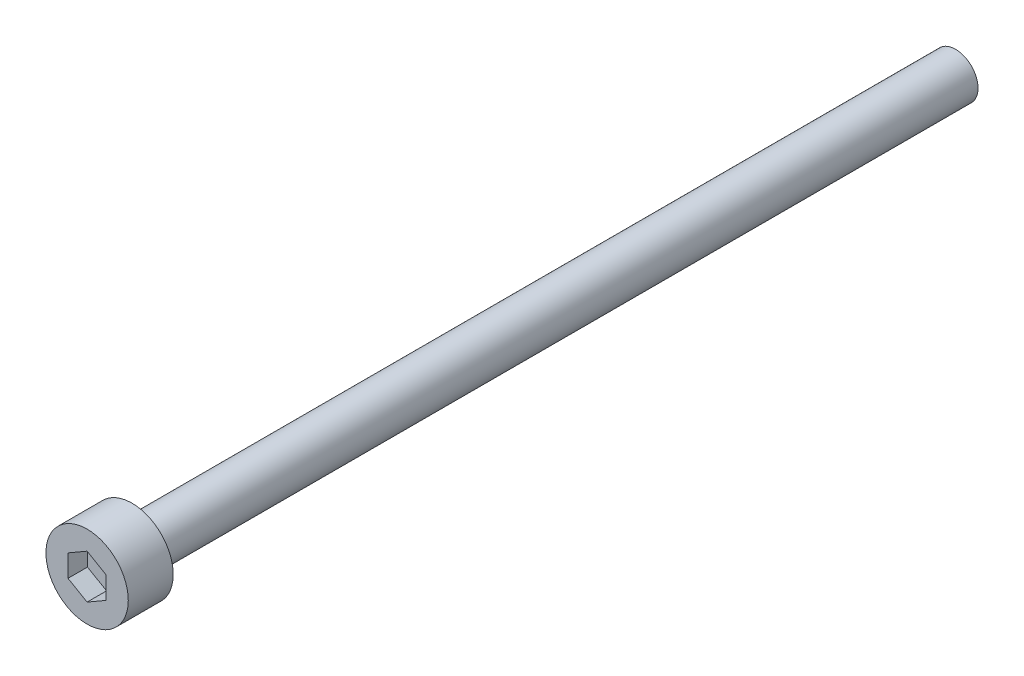
ISO-10303-21;
HEADER;
FILE_DESCRIPTION(('STEP AP214'),'2;1');
FILE_NAME('part.step','',(''),(''),'','','');
FILE_SCHEMA(('AUTOMOTIVE_DESIGN { 1 0 10303 214 1 1 1 1 }'));
ENDSEC;
DATA;
#1=APPLICATION_CONTEXT('core data for automotive mechanical design processes');
#2=APPLICATION_PROTOCOL_DEFINITION('international standard','automotive_design',2000,#1);
#3=PRODUCT_CONTEXT('',#1,'mechanical');
#4=PRODUCT('Part','Part','',(#3));
#5=PRODUCT_RELATED_PRODUCT_CATEGORY('part','',(#4));
#6=PRODUCT_DEFINITION_FORMATION('','',#4);
#7=PRODUCT_DEFINITION_CONTEXT('part definition',#1,'design');
#8=PRODUCT_DEFINITION('design','',#6,#7);
#9=PRODUCT_DEFINITION_SHAPE('','',#8);
#10=(LENGTH_UNIT() NAMED_UNIT(*) SI_UNIT(.MILLI.,.METRE.));
#11=(NAMED_UNIT(*) PLANE_ANGLE_UNIT() SI_UNIT($,.RADIAN.));
#12=(NAMED_UNIT(*) SI_UNIT($,.STERADIAN.) SOLID_ANGLE_UNIT());
#13=UNCERTAINTY_MEASURE_WITH_UNIT(LENGTH_MEASURE(1.E-05),#10,'distance_accuracy_value','');
#14=(GEOMETRIC_REPRESENTATION_CONTEXT(3) GLOBAL_UNCERTAINTY_ASSIGNED_CONTEXT((#13)) GLOBAL_UNIT_ASSIGNED_CONTEXT((#10,
#11,#12)) REPRESENTATION_CONTEXT('',''));
#15=CARTESIAN_POINT('',(0.,0.,0.));
#16=DIRECTION('',(0.,0.,1.));
#17=DIRECTION('',(1.,0.,0.));
#18=AXIS2_PLACEMENT_3D('',#15,#16,#17);
#19=CARTESIAN_POINT('',(0.,0.,3.));
#20=DIRECTION('',(0.,0.,-1.));
#21=DIRECTION('',(-1.,0.,0.));
#22=AXIS2_PLACEMENT_3D('',#19,#20,#21);
#23=CYLINDRICAL_SURFACE('',#22,2.75);
#24=CARTESIAN_POINT('',(0.,0.,3.));
#25=DIRECTION('',(0.,0.,1.));
#26=DIRECTION('',(1.,0.,0.));
#27=AXIS2_PLACEMENT_3D('',#24,#25,#26);
#28=CIRCLE('',#27,2.75);
#29=CARTESIAN_POINT('',(2.75,0.,3.));
#30=VERTEX_POINT('',#29);
#31=EDGE_CURVE('E49',#30,#30,#28,.T.);
#32=ORIENTED_EDGE('',*,*,#31,.F.);
#33=EDGE_LOOP('',(#32));
#34=FACE_BOUND('',#33,.T.);
#35=CARTESIAN_POINT('',(0.,0.,0.));
#36=DIRECTION('',(0.,0.,1.));
#37=DIRECTION('',(1.,0.,0.));
#38=AXIS2_PLACEMENT_3D('',#35,#36,#37);
#39=CIRCLE('',#38,2.75);
#40=CARTESIAN_POINT('',(2.75,0.,0.));
#41=VERTEX_POINT('',#40);
#42=EDGE_CURVE('E44',#41,#41,#39,.T.);
#43=ORIENTED_EDGE('',*,*,#42,.T.);
#44=EDGE_LOOP('',(#43));
#45=FACE_BOUND('',#44,.T.);
#46=ADVANCED_FACE('F41',(#34,#45),#23,.T.);
#47=CARTESIAN_POINT('',(0.,0.,3.));
#48=DIRECTION('',(0.,0.,1.));
#49=DIRECTION('',(1.,0.,0.));
#50=AXIS2_PLACEMENT_3D('',#47,#48,#49);
#51=PLANE('',#50);
#52=DIRECTION('',(0.866025403784439,0.5,0.));
#53=VECTOR('',#52,1.);
#54=CARTESIAN_POINT('',(0.,-1.47224318643355,3.));
#55=LINE('',#54,#53);
#56=CARTESIAN_POINT('',(0.,-1.47224318643355,3.));
#57=VERTEX_POINT('',#56);
#58=CARTESIAN_POINT('',(1.275,-0.736121593216773,3.));
#59=VERTEX_POINT('',#58);
#60=EDGE_CURVE('E57',#57,#59,#55,.T.);
#61=ORIENTED_EDGE('',*,*,#60,.F.);
#62=DIRECTION('',(0.866025403784439,-0.5,0.));
#63=VECTOR('',#62,1.);
#64=CARTESIAN_POINT('',(-1.275,-0.736121593216773,3.));
#65=LINE('',#64,#63);
#66=CARTESIAN_POINT('',(-1.275,-0.736121593216773,3.));
#67=VERTEX_POINT('',#66);
#68=EDGE_CURVE('E141',#67,#57,#65,.T.);
#69=ORIENTED_EDGE('',*,*,#68,.F.);
#70=DIRECTION('',(0.,-1.,0.));
#71=VECTOR('',#70,1.);
#72=CARTESIAN_POINT('',(-1.275,0.736121593216774,3.));
#73=LINE('',#72,#71);
#74=CARTESIAN_POINT('',(-1.275,0.736121593216774,3.));
#75=VERTEX_POINT('',#74);
#76=EDGE_CURVE('E139',#75,#67,#73,.T.);
#77=ORIENTED_EDGE('',*,*,#76,.F.);
#78=DIRECTION('',(-0.866025403784439,-0.5,0.));
#79=VECTOR('',#78,1.);
#80=CARTESIAN_POINT('',(0.,1.47224318643355,3.));
#81=LINE('',#80,#79);
#82=CARTESIAN_POINT('',(0.,1.47224318643355,3.));
#83=VERTEX_POINT('',#82);
#84=EDGE_CURVE('E105',#83,#75,#81,.T.);
#85=ORIENTED_EDGE('',*,*,#84,.F.);
#86=DIRECTION('',(-0.866025403784439,0.5,0.));
#87=VECTOR('',#86,1.);
#88=CARTESIAN_POINT('',(1.275,0.736121593216773,3.));
#89=LINE('',#88,#87);
#90=CARTESIAN_POINT('',(1.275,0.736121593216773,3.));
#91=VERTEX_POINT('',#90);
#92=EDGE_CURVE('E135',#91,#83,#89,.T.);
#93=ORIENTED_EDGE('',*,*,#92,.F.);
#94=DIRECTION('',(0.,1.,0.));
#95=VECTOR('',#94,1.);
#96=CARTESIAN_POINT('',(1.275,-0.736121593216773,3.));
#97=LINE('',#96,#95);
#98=EDGE_CURVE('E131',#59,#91,#97,.T.);
#99=ORIENTED_EDGE('',*,*,#98,.F.);
#100=EDGE_LOOP('',(#61,#69,#77,#85,#93,#99));
#101=FACE_BOUND('',#100,.T.);
#102=ORIENTED_EDGE('',*,*,#31,.T.);
#103=EDGE_LOOP('',(#102));
#104=FACE_BOUND('',#103,.T.);
#105=ADVANCED_FACE('F159',(#101,#104),#51,.T.);
#106=CARTESIAN_POINT('',(0.,0.,0.));
#107=DIRECTION('',(0.,0.,1.));
#108=DIRECTION('',(1.,0.,0.));
#109=AXIS2_PLACEMENT_3D('',#106,#107,#108);
#110=PLANE('',#109);
#111=CARTESIAN_POINT('',(0.,0.,0.));
#112=DIRECTION('',(0.,0.,-1.));
#113=DIRECTION('',(-1.,0.,0.));
#114=AXIS2_PLACEMENT_3D('',#111,#112,#113);
#115=CIRCLE('',#114,1.5);
#116=CARTESIAN_POINT('',(-1.5,0.,0.));
#117=VERTEX_POINT('',#116);
#118=EDGE_CURVE('E11',#117,#117,#115,.T.);
#119=ORIENTED_EDGE('',*,*,#118,.F.);
#120=EDGE_LOOP('',(#119));
#121=FACE_BOUND('',#120,.T.);
#122=ORIENTED_EDGE('',*,*,#42,.F.);
#123=EDGE_LOOP('',(#122));
#124=FACE_BOUND('',#123,.T.);
#125=ADVANCED_FACE('F156',(#121,#124),#110,.F.);
#126=CARTESIAN_POINT('',(0.,-1.47224318643355,1.7));
#127=DIRECTION('',(0.5,-0.866025403784439,0.));
#128=DIRECTION('',(0.866025403784439,0.5,0.));
#129=AXIS2_PLACEMENT_3D('',#126,#127,#128);
#130=PLANE('',#129);
#131=ORIENTED_EDGE('',*,*,#60,.T.);
#132=DIRECTION('',(0.,0.,1.));
#133=VECTOR('',#132,1.);
#134=CARTESIAN_POINT('',(1.275,-0.736121593216773,1.7));
#135=LINE('',#134,#133);
#136=CARTESIAN_POINT('',(1.275,-0.736121593216773,1.7));
#137=VERTEX_POINT('',#136);
#138=EDGE_CURVE('E87',#137,#59,#135,.T.);
#139=ORIENTED_EDGE('',*,*,#138,.F.);
#140=DIRECTION('',(0.866025403784439,0.5,0.));
#141=VECTOR('',#140,1.);
#142=CARTESIAN_POINT('',(0.,-1.47224318643355,1.7));
#143=LINE('',#142,#141);
#144=CARTESIAN_POINT('',(0.,-1.47224318643355,1.7));
#145=VERTEX_POINT('',#144);
#146=EDGE_CURVE('E143',#145,#137,#143,.T.);
#147=ORIENTED_EDGE('',*,*,#146,.F.);
#148=DIRECTION('',(0.,0.,1.));
#149=VECTOR('',#148,1.);
#150=CARTESIAN_POINT('',(0.,-1.47224318643355,1.7));
#151=LINE('',#150,#149);
#152=EDGE_CURVE('E65',#145,#57,#151,.T.);
#153=ORIENTED_EDGE('',*,*,#152,.T.);
#154=EDGE_LOOP('',(#131,#139,#147,#153));
#155=FACE_BOUND('',#154,.T.);
#156=ADVANCED_FACE('F158',(#155),#130,.F.);
#157=CARTESIAN_POINT('',(-1.275,-0.736121593216773,1.7));
#158=DIRECTION('',(-0.5,-0.866025403784439,0.));
#159=DIRECTION('',(0.866025403784439,-0.5,0.));
#160=AXIS2_PLACEMENT_3D('',#157,#158,#159);
#161=PLANE('',#160);
#162=ORIENTED_EDGE('',*,*,#68,.T.);
#163=ORIENTED_EDGE('',*,*,#152,.F.);
#164=DIRECTION('',(0.866025403784439,-0.5,0.));
#165=VECTOR('',#164,1.);
#166=CARTESIAN_POINT('',(-1.275,-0.736121593216773,1.7));
#167=LINE('',#166,#165);
#168=CARTESIAN_POINT('',(-1.275,-0.736121593216773,1.7));
#169=VERTEX_POINT('',#168);
#170=EDGE_CURVE('E117',#169,#145,#167,.T.);
#171=ORIENTED_EDGE('',*,*,#170,.F.);
#172=DIRECTION('',(0.,0.,1.));
#173=VECTOR('',#172,1.);
#174=CARTESIAN_POINT('',(-1.275,-0.736121593216773,1.7));
#175=LINE('',#174,#173);
#176=EDGE_CURVE('E109',#169,#67,#175,.T.);
#177=ORIENTED_EDGE('',*,*,#176,.T.);
#178=EDGE_LOOP('',(#162,#163,#171,#177));
#179=FACE_BOUND('',#178,.T.);
#180=ADVANCED_FACE('F165',(#179),#161,.F.);
#181=CARTESIAN_POINT('',(-1.275,0.736121593216774,1.7));
#182=DIRECTION('',(-1.,0.,0.));
#183=DIRECTION('',(0.,0.,1.));
#184=AXIS2_PLACEMENT_3D('',#181,#182,#183);
#185=PLANE('',#184);
#186=ORIENTED_EDGE('',*,*,#76,.T.);
#187=ORIENTED_EDGE('',*,*,#176,.F.);
#188=DIRECTION('',(0.,-1.,0.));
#189=VECTOR('',#188,1.);
#190=CARTESIAN_POINT('',(-1.275,0.736121593216774,1.7));
#191=LINE('',#190,#189);
#192=CARTESIAN_POINT('',(-1.275,0.736121593216774,1.7));
#193=VERTEX_POINT('',#192);
#194=EDGE_CURVE('E113',#193,#169,#191,.T.);
#195=ORIENTED_EDGE('',*,*,#194,.F.);
#196=DIRECTION('',(0.,0.,1.));
#197=VECTOR('',#196,1.);
#198=CARTESIAN_POINT('',(-1.275,0.736121593216774,1.7));
#199=LINE('',#198,#197);
#200=EDGE_CURVE('E98',#193,#75,#199,.T.);
#201=ORIENTED_EDGE('',*,*,#200,.T.);
#202=EDGE_LOOP('',(#186,#187,#195,#201));
#203=FACE_BOUND('',#202,.T.);
#204=ADVANCED_FACE('F114',(#203),#185,.F.);
#205=CARTESIAN_POINT('',(0.,1.47224318643355,1.7));
#206=DIRECTION('',(-0.5,0.866025403784439,0.));
#207=DIRECTION('',(-0.866025403784439,-0.5,0.));
#208=AXIS2_PLACEMENT_3D('',#205,#206,#207);
#209=PLANE('',#208);
#210=ORIENTED_EDGE('',*,*,#84,.T.);
#211=ORIENTED_EDGE('',*,*,#200,.F.);
#212=DIRECTION('',(-0.866025403784439,-0.5,0.));
#213=VECTOR('',#212,1.);
#214=CARTESIAN_POINT('',(0.,1.47224318643355,1.7));
#215=LINE('',#214,#213);
#216=CARTESIAN_POINT('',(0.,1.47224318643355,1.7));
#217=VERTEX_POINT('',#216);
#218=EDGE_CURVE('E102',#217,#193,#215,.T.);
#219=ORIENTED_EDGE('',*,*,#218,.F.);
#220=DIRECTION('',(0.,0.,1.));
#221=VECTOR('',#220,1.);
#222=CARTESIAN_POINT('',(0.,1.47224318643355,1.7));
#223=LINE('',#222,#221);
#224=EDGE_CURVE('E110',#217,#83,#223,.T.);
#225=ORIENTED_EDGE('',*,*,#224,.T.);
#226=EDGE_LOOP('',(#210,#211,#219,#225));
#227=FACE_BOUND('',#226,.T.);
#228=ADVANCED_FACE('F100',(#227),#209,.F.);
#229=CARTESIAN_POINT('',(1.275,0.736121593216773,1.7));
#230=DIRECTION('',(0.5,0.866025403784439,0.));
#231=DIRECTION('',(-0.866025403784439,0.5,0.));
#232=AXIS2_PLACEMENT_3D('',#229,#230,#231);
#233=PLANE('',#232);
#234=ORIENTED_EDGE('',*,*,#92,.T.);
#235=ORIENTED_EDGE('',*,*,#224,.F.);
#236=DIRECTION('',(-0.866025403784439,0.5,0.));
#237=VECTOR('',#236,1.);
#238=CARTESIAN_POINT('',(1.275,0.736121593216773,1.7));
#239=LINE('',#238,#237);
#240=CARTESIAN_POINT('',(1.275,0.736121593216773,1.7));
#241=VERTEX_POINT('',#240);
#242=EDGE_CURVE('E123',#241,#217,#239,.T.);
#243=ORIENTED_EDGE('',*,*,#242,.F.);
#244=DIRECTION('',(0.,0.,1.));
#245=VECTOR('',#244,1.);
#246=CARTESIAN_POINT('',(1.275,0.736121593216773,1.7));
#247=LINE('',#246,#245);
#248=EDGE_CURVE('E147',#241,#91,#247,.T.);
#249=ORIENTED_EDGE('',*,*,#248,.T.);
#250=EDGE_LOOP('',(#234,#235,#243,#249));
#251=FACE_BOUND('',#250,.T.);
#252=ADVANCED_FACE('F210',(#251),#233,.F.);
#253=CARTESIAN_POINT('',(1.275,-0.736121593216773,1.7));
#254=DIRECTION('',(1.,0.,0.));
#255=DIRECTION('',(0.,0.,-1.));
#256=AXIS2_PLACEMENT_3D('',#253,#254,#255);
#257=PLANE('',#256);
#258=ORIENTED_EDGE('',*,*,#98,.T.);
#259=ORIENTED_EDGE('',*,*,#248,.F.);
#260=DIRECTION('',(0.,1.,0.));
#261=VECTOR('',#260,1.);
#262=CARTESIAN_POINT('',(1.275,-0.736121593216773,1.7));
#263=LINE('',#262,#261);
#264=EDGE_CURVE('E125',#137,#241,#263,.T.);
#265=ORIENTED_EDGE('',*,*,#264,.F.);
#266=ORIENTED_EDGE('',*,*,#138,.T.);
#267=EDGE_LOOP('',(#258,#259,#265,#266));
#268=FACE_BOUND('',#267,.T.);
#269=ADVANCED_FACE('F219',(#268),#257,.F.);
#270=CARTESIAN_POINT('',(0.,0.,1.7));
#271=DIRECTION('',(0.,0.,1.));
#272=DIRECTION('',(1.,0.,0.));
#273=AXIS2_PLACEMENT_3D('',#270,#271,#272);
#274=PLANE('',#273);
#275=ORIENTED_EDGE('',*,*,#146,.T.);
#276=ORIENTED_EDGE('',*,*,#264,.T.);
#277=ORIENTED_EDGE('',*,*,#242,.T.);
#278=ORIENTED_EDGE('',*,*,#218,.T.);
#279=ORIENTED_EDGE('',*,*,#194,.T.);
#280=ORIENTED_EDGE('',*,*,#170,.T.);
#281=EDGE_LOOP('',(#275,#276,#277,#278,#279,#280));
#282=FACE_BOUND('',#281,.T.);
#283=ADVANCED_FACE('F120',(#282),#274,.T.);
#284=CARTESIAN_POINT('',(0.,0.,-55.));
#285=DIRECTION('',(0.,0.,1.));
#286=DIRECTION('',(1.,0.,0.));
#287=AXIS2_PLACEMENT_3D('',#284,#285,#286);
#288=CYLINDRICAL_SURFACE('',#287,1.5);
#289=CARTESIAN_POINT('',(0.,0.,-55.));
#290=DIRECTION('',(0.,0.,-1.));
#291=DIRECTION('',(-1.,0.,0.));
#292=AXIS2_PLACEMENT_3D('',#289,#290,#291);
#293=CIRCLE('',#292,1.5);
#294=CARTESIAN_POINT('',(-1.5,0.,-55.));
#295=VERTEX_POINT('',#294);
#296=EDGE_CURVE('E132',#295,#295,#293,.T.);
#297=ORIENTED_EDGE('',*,*,#296,.F.);
#298=EDGE_LOOP('',(#297));
#299=FACE_BOUND('',#298,.T.);
#300=ORIENTED_EDGE('',*,*,#118,.T.);
#301=EDGE_LOOP('',(#300));
#302=FACE_BOUND('',#301,.T.);
#303=ADVANCED_FACE('F237',(#299,#302),#288,.T.);
#304=CARTESIAN_POINT('',(0.,0.,-55.));
#305=DIRECTION('',(0.,0.,-1.));
#306=DIRECTION('',(-1.,0.,0.));
#307=AXIS2_PLACEMENT_3D('',#304,#305,#306);
#308=PLANE('',#307);
#309=ORIENTED_EDGE('',*,*,#296,.T.);
#310=EDGE_LOOP('',(#309));
#311=FACE_BOUND('',#310,.T.);
#312=ADVANCED_FACE('F251',(#311),#308,.T.);
#313=CLOSED_SHELL('',(#46,#105,#125,#156,#180,#204,#228,#252,#269,#283,#303,#312));
#314=MANIFOLD_SOLID_BREP('B2',#313);
#315=ADVANCED_BREP_SHAPE_REPRESENTATION('',(#18,#314),#14);
#316=SHAPE_DEFINITION_REPRESENTATION(#9,#315);
ENDSEC;
END-ISO-10303-21;
